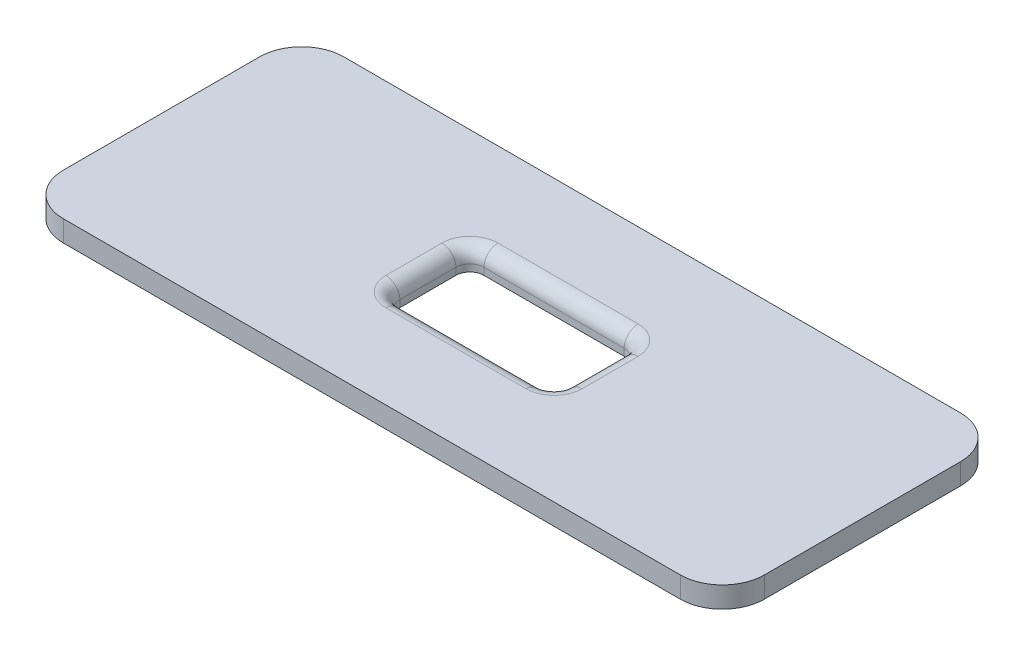
ISO-10303-21;
HEADER;
FILE_DESCRIPTION(('STEP AP214'),'2;1');
FILE_NAME('part.step','',(''),(''),'','','');
FILE_SCHEMA(('AUTOMOTIVE_DESIGN { 1 0 10303 214 1 1 1 1 }'));
ENDSEC;
DATA;
#1=APPLICATION_CONTEXT('core data for automotive mechanical design processes');
#2=APPLICATION_PROTOCOL_DEFINITION('international standard','automotive_design',2000,#1);
#3=PRODUCT_CONTEXT('',#1,'mechanical');
#4=PRODUCT('Part','Part','',(#3));
#5=PRODUCT_RELATED_PRODUCT_CATEGORY('part','',(#4));
#6=PRODUCT_DEFINITION_FORMATION('','',#4);
#7=PRODUCT_DEFINITION_CONTEXT('part definition',#1,'design');
#8=PRODUCT_DEFINITION('design','',#6,#7);
#9=PRODUCT_DEFINITION_SHAPE('','',#8);
#10=(LENGTH_UNIT() NAMED_UNIT(*) SI_UNIT(.MILLI.,.METRE.));
#11=(NAMED_UNIT(*) PLANE_ANGLE_UNIT() SI_UNIT($,.RADIAN.));
#12=(NAMED_UNIT(*) SI_UNIT($,.STERADIAN.) SOLID_ANGLE_UNIT());
#13=UNCERTAINTY_MEASURE_WITH_UNIT(LENGTH_MEASURE(1.E-05),#10,'distance_accuracy_value','');
#14=(GEOMETRIC_REPRESENTATION_CONTEXT(3) GLOBAL_UNCERTAINTY_ASSIGNED_CONTEXT((#13)) GLOBAL_UNIT_ASSIGNED_CONTEXT((#10,
#11,#12)) REPRESENTATION_CONTEXT('',''));
#15=CARTESIAN_POINT('',(0.,0.,0.));
#16=DIRECTION('',(0.,0.,1.));
#17=DIRECTION('',(1.,0.,0.));
#18=AXIS2_PLACEMENT_3D('',#15,#16,#17);
#19=CARTESIAN_POINT('',(22.,1.5,-7.));
#20=DIRECTION('',(0.,1.,0.));
#21=DIRECTION('',(0.,0.,1.));
#22=AXIS2_PLACEMENT_3D('',#19,#20,#21);
#23=PLANE('',#22);
#24=DIRECTION('',(1.,0.,0.));
#25=VECTOR('',#24,1.);
#26=CARTESIAN_POINT('',(22.,1.5,4.));
#27=LINE('',#26,#25);
#28=CARTESIAN_POINT('',(4.99999999999998,1.5,4.));
#29=VERTEX_POINT('',#28);
#30=CARTESIAN_POINT('',(-4.99999999999999,1.5,4.));
#31=VERTEX_POINT('',#30);
#32=EDGE_CURVE('E287',#29,#31,#27,.F.);
#33=ORIENTED_EDGE('',*,*,#32,.T.);
#34=CARTESIAN_POINT('',(-5.,1.5,2.));
#35=DIRECTION('',(0.,1.,0.));
#36=DIRECTION('',(0.,0.,1.));
#37=AXIS2_PLACEMENT_3D('',#34,#35,#36);
#38=CIRCLE('',#37,2.);
#39=CARTESIAN_POINT('',(-7.,1.5,1.99999999999999));
#40=VERTEX_POINT('',#39);
#41=EDGE_CURVE('E301',#31,#40,#38,.F.);
#42=ORIENTED_EDGE('',*,*,#41,.T.);
#43=DIRECTION('',(0.,0.,1.));
#44=VECTOR('',#43,1.);
#45=CARTESIAN_POINT('',(-7.,1.5,-6.99999999999999));
#46=LINE('',#45,#44);
#47=CARTESIAN_POINT('',(-7.,1.5,-1.99999999999999));
#48=VERTEX_POINT('',#47);
#49=EDGE_CURVE('E299',#40,#48,#46,.F.);
#50=ORIENTED_EDGE('',*,*,#49,.T.);
#51=CARTESIAN_POINT('',(-5.,1.5,-2.));
#52=DIRECTION('',(0.,1.,0.));
#53=DIRECTION('',(0.,0.,1.));
#54=AXIS2_PLACEMENT_3D('',#51,#52,#53);
#55=CIRCLE('',#54,2.);
#56=CARTESIAN_POINT('',(-4.99999999999999,1.5,-4.));
#57=VERTEX_POINT('',#56);
#58=EDGE_CURVE('E297',#48,#57,#55,.F.);
#59=ORIENTED_EDGE('',*,*,#58,.T.);
#60=DIRECTION('',(-1.,0.,0.));
#61=VECTOR('',#60,1.);
#62=CARTESIAN_POINT('',(22.,1.5,-4.));
#63=LINE('',#62,#61);
#64=CARTESIAN_POINT('',(4.99999999999999,1.5,-4.));
#65=VERTEX_POINT('',#64);
#66=EDGE_CURVE('E295',#57,#65,#63,.F.);
#67=ORIENTED_EDGE('',*,*,#66,.T.);
#68=CARTESIAN_POINT('',(5.,1.5,-2.));
#69=DIRECTION('',(0.,1.,0.));
#70=DIRECTION('',(0.,0.,1.));
#71=AXIS2_PLACEMENT_3D('',#68,#69,#70);
#72=CIRCLE('',#71,2.);
#73=CARTESIAN_POINT('',(7.,1.5,-1.99999999999998));
#74=VERTEX_POINT('',#73);
#75=EDGE_CURVE('E293',#65,#74,#72,.F.);
#76=ORIENTED_EDGE('',*,*,#75,.T.);
#77=DIRECTION('',(0.,0.,-1.));
#78=VECTOR('',#77,1.);
#79=CARTESIAN_POINT('',(7.,1.5,-6.99999999999999));
#80=LINE('',#79,#78);
#81=CARTESIAN_POINT('',(7.,1.5,2.));
#82=VERTEX_POINT('',#81);
#83=EDGE_CURVE('E291',#74,#82,#80,.F.);
#84=ORIENTED_EDGE('',*,*,#83,.T.);
#85=CARTESIAN_POINT('',(5.,1.5,2.));
#86=DIRECTION('',(0.,1.,0.));
#87=DIRECTION('',(0.,0.,1.));
#88=AXIS2_PLACEMENT_3D('',#85,#86,#87);
#89=CIRCLE('',#88,2.);
#90=EDGE_CURVE('E289',#82,#29,#89,.F.);
#91=ORIENTED_EDGE('',*,*,#90,.T.);
#92=EDGE_LOOP('',(#33,#42,#50,#59,#67,#76,#84,#91));
#93=FACE_BOUND('',#92,.T.);
#94=CARTESIAN_POINT('',(22.,1.5,-7.));
#95=DIRECTION('',(0.,1.,0.));
#96=DIRECTION('',(0.,0.,1.));
#97=AXIS2_PLACEMENT_3D('',#94,#95,#96);
#98=CIRCLE('',#97,3.);
#99=CARTESIAN_POINT('',(25.,1.5,-6.99999999999998));
#100=VERTEX_POINT('',#99);
#101=CARTESIAN_POINT('',(22.,1.5,-10.));
#102=VERTEX_POINT('',#101);
#103=EDGE_CURVE('E227',#100,#102,#98,.T.);
#104=ORIENTED_EDGE('',*,*,#103,.T.);
#105=DIRECTION('',(-1.,0.,0.));
#106=VECTOR('',#105,1.);
#107=CARTESIAN_POINT('',(-22.,1.5,-10.));
#108=LINE('',#107,#106);
#109=CARTESIAN_POINT('',(-22.,1.5,-10.));
#110=VERTEX_POINT('',#109);
#111=EDGE_CURVE('E230',#102,#110,#108,.T.);
#112=ORIENTED_EDGE('',*,*,#111,.T.);
#113=CARTESIAN_POINT('',(-22.,1.5,-7.));
#114=DIRECTION('',(0.,1.,0.));
#115=DIRECTION('',(0.,0.,-1.));
#116=AXIS2_PLACEMENT_3D('',#113,#114,#115);
#117=CIRCLE('',#116,3.);
#118=CARTESIAN_POINT('',(-25.,1.5,-6.99999999999998));
#119=VERTEX_POINT('',#118);
#120=EDGE_CURVE('E233',#110,#119,#117,.T.);
#121=ORIENTED_EDGE('',*,*,#120,.T.);
#122=DIRECTION('',(0.,0.,1.));
#123=VECTOR('',#122,1.);
#124=CARTESIAN_POINT('',(-25.,1.5,-6.99999999999998));
#125=LINE('',#124,#123);
#126=CARTESIAN_POINT('',(-25.,1.5,6.99999999999998));
#127=VERTEX_POINT('',#126);
#128=EDGE_CURVE('E235',#119,#127,#125,.T.);
#129=ORIENTED_EDGE('',*,*,#128,.T.);
#130=CARTESIAN_POINT('',(-22.,1.5,7.));
#131=DIRECTION('',(0.,1.,0.));
#132=DIRECTION('',(0.,0.,-1.));
#133=AXIS2_PLACEMENT_3D('',#130,#131,#132);
#134=CIRCLE('',#133,3.);
#135=CARTESIAN_POINT('',(-22.,1.5,10.));
#136=VERTEX_POINT('',#135);
#137=EDGE_CURVE('E237',#127,#136,#134,.T.);
#138=ORIENTED_EDGE('',*,*,#137,.T.);
#139=DIRECTION('',(1.,0.,0.));
#140=VECTOR('',#139,1.);
#141=CARTESIAN_POINT('',(-22.,1.5,10.));
#142=LINE('',#141,#140);
#143=CARTESIAN_POINT('',(22.,1.5,10.));
#144=VERTEX_POINT('',#143);
#145=EDGE_CURVE('E239',#136,#144,#142,.T.);
#146=ORIENTED_EDGE('',*,*,#145,.T.);
#147=CARTESIAN_POINT('',(22.,1.5,7.));
#148=DIRECTION('',(0.,1.,0.));
#149=DIRECTION('',(0.,0.,1.));
#150=AXIS2_PLACEMENT_3D('',#147,#148,#149);
#151=CIRCLE('',#150,3.);
#152=CARTESIAN_POINT('',(25.,1.5,6.99999999999998));
#153=VERTEX_POINT('',#152);
#154=EDGE_CURVE('E241',#144,#153,#151,.T.);
#155=ORIENTED_EDGE('',*,*,#154,.T.);
#156=DIRECTION('',(0.,0.,-1.));
#157=VECTOR('',#156,1.);
#158=CARTESIAN_POINT('',(25.,1.5,-6.99999999999998));
#159=LINE('',#158,#157);
#160=EDGE_CURVE('E243',#153,#100,#159,.T.);
#161=ORIENTED_EDGE('',*,*,#160,.T.);
#162=EDGE_LOOP('',(#104,#112,#121,#129,#138,#146,#155,#161));
#163=FACE_BOUND('',#162,.T.);
#164=ADVANCED_FACE('F33',(#93,#163),#23,.T.);
#165=CARTESIAN_POINT('',(22.,0.,-7.));
#166=DIRECTION('',(0.,1.,0.));
#167=DIRECTION('',(0.,0.,1.));
#168=AXIS2_PLACEMENT_3D('',#165,#166,#167);
#169=PLANE('',#168);
#170=CARTESIAN_POINT('',(22.,0.,-7.));
#171=DIRECTION('',(0.,1.,0.));
#172=DIRECTION('',(0.,0.,1.));
#173=AXIS2_PLACEMENT_3D('',#170,#171,#172);
#174=CIRCLE('',#173,3.);
#175=CARTESIAN_POINT('',(25.,0.,-6.99999999999998));
#176=VERTEX_POINT('',#175);
#177=CARTESIAN_POINT('',(22.,0.,-10.));
#178=VERTEX_POINT('',#177);
#179=EDGE_CURVE('E181',#176,#178,#174,.T.);
#180=ORIENTED_EDGE('',*,*,#179,.F.);
#181=DIRECTION('',(0.,0.,-1.));
#182=VECTOR('',#181,1.);
#183=CARTESIAN_POINT('',(25.,0.,-6.99999999999998));
#184=LINE('',#183,#182);
#185=CARTESIAN_POINT('',(25.,0.,6.99999999999998));
#186=VERTEX_POINT('',#185);
#187=EDGE_CURVE('E231',#186,#176,#184,.T.);
#188=ORIENTED_EDGE('',*,*,#187,.F.);
#189=CARTESIAN_POINT('',(22.,0.,7.));
#190=DIRECTION('',(0.,1.,0.));
#191=DIRECTION('',(0.,0.,1.));
#192=AXIS2_PLACEMENT_3D('',#189,#190,#191);
#193=CIRCLE('',#192,3.);
#194=CARTESIAN_POINT('',(22.,0.,10.));
#195=VERTEX_POINT('',#194);
#196=EDGE_CURVE('E258',#195,#186,#193,.T.);
#197=ORIENTED_EDGE('',*,*,#196,.F.);
#198=DIRECTION('',(1.,0.,0.));
#199=VECTOR('',#198,1.);
#200=CARTESIAN_POINT('',(-22.,0.,10.));
#201=LINE('',#200,#199);
#202=CARTESIAN_POINT('',(-22.,0.,10.));
#203=VERTEX_POINT('',#202);
#204=EDGE_CURVE('E256',#203,#195,#201,.T.);
#205=ORIENTED_EDGE('',*,*,#204,.F.);
#206=CARTESIAN_POINT('',(-22.,0.,7.));
#207=DIRECTION('',(0.,1.,0.));
#208=DIRECTION('',(0.,0.,-1.));
#209=AXIS2_PLACEMENT_3D('',#206,#207,#208);
#210=CIRCLE('',#209,3.);
#211=CARTESIAN_POINT('',(-25.,0.,6.99999999999998));
#212=VERTEX_POINT('',#211);
#213=EDGE_CURVE('E254',#212,#203,#210,.T.);
#214=ORIENTED_EDGE('',*,*,#213,.F.);
#215=DIRECTION('',(0.,0.,1.));
#216=VECTOR('',#215,1.);
#217=CARTESIAN_POINT('',(-25.,0.,-6.99999999999998));
#218=LINE('',#217,#216);
#219=CARTESIAN_POINT('',(-25.,0.,-6.99999999999998));
#220=VERTEX_POINT('',#219);
#221=EDGE_CURVE('E252',#220,#212,#218,.T.);
#222=ORIENTED_EDGE('',*,*,#221,.F.);
#223=CARTESIAN_POINT('',(-22.,0.,-7.));
#224=DIRECTION('',(0.,1.,0.));
#225=DIRECTION('',(0.,0.,-1.));
#226=AXIS2_PLACEMENT_3D('',#223,#224,#225);
#227=CIRCLE('',#226,3.);
#228=CARTESIAN_POINT('',(-22.,0.,-10.));
#229=VERTEX_POINT('',#228);
#230=EDGE_CURVE('E250',#229,#220,#227,.T.);
#231=ORIENTED_EDGE('',*,*,#230,.F.);
#232=DIRECTION('',(-1.,0.,0.));
#233=VECTOR('',#232,1.);
#234=CARTESIAN_POINT('',(-22.,0.,-10.));
#235=LINE('',#234,#233);
#236=EDGE_CURVE('E248',#178,#229,#235,.T.);
#237=ORIENTED_EDGE('',*,*,#236,.F.);
#238=EDGE_LOOP('',(#180,#188,#197,#205,#214,#222,#231,#237));
#239=FACE_BOUND('',#238,.T.);
#240=CARTESIAN_POINT('',(5.,0.,-2.));
#241=DIRECTION('',(0.,1.,0.));
#242=DIRECTION('',(0.,0.,-1.));
#243=AXIS2_PLACEMENT_3D('',#240,#241,#242);
#244=CIRCLE('',#243,1.);
#245=CARTESIAN_POINT('',(6.,0.,-1.99999999999999));
#246=VERTEX_POINT('',#245);
#247=CARTESIAN_POINT('',(4.99999999999999,0.,-3.));
#248=VERTEX_POINT('',#247);
#249=EDGE_CURVE('E175',#246,#248,#244,.T.);
#250=ORIENTED_EDGE('',*,*,#249,.T.);
#251=DIRECTION('',(-1.,0.,0.));
#252=VECTOR('',#251,1.);
#253=CARTESIAN_POINT('',(-5.,0.,-3.));
#254=LINE('',#253,#252);
#255=CARTESIAN_POINT('',(-5.,0.,-3.));
#256=VERTEX_POINT('',#255);
#257=EDGE_CURVE('E185',#248,#256,#254,.T.);
#258=ORIENTED_EDGE('',*,*,#257,.T.);
#259=CARTESIAN_POINT('',(-5.,0.,-2.));
#260=DIRECTION('',(0.,1.,0.));
#261=DIRECTION('',(0.,0.,-1.));
#262=AXIS2_PLACEMENT_3D('',#259,#260,#261);
#263=CIRCLE('',#262,1.);
#264=CARTESIAN_POINT('',(-6.,0.,-1.99999999999999));
#265=VERTEX_POINT('',#264);
#266=EDGE_CURVE('E191',#256,#265,#263,.T.);
#267=ORIENTED_EDGE('',*,*,#266,.T.);
#268=DIRECTION('',(0.,0.,1.));
#269=VECTOR('',#268,1.);
#270=CARTESIAN_POINT('',(-6.,0.,-1.99999999999999));
#271=LINE('',#270,#269);
#272=CARTESIAN_POINT('',(-6.,0.,2.));
#273=VERTEX_POINT('',#272);
#274=EDGE_CURVE('E202',#265,#273,#271,.T.);
#275=ORIENTED_EDGE('',*,*,#274,.T.);
#276=CARTESIAN_POINT('',(-5.,0.,2.));
#277=DIRECTION('',(0.,1.,0.));
#278=DIRECTION('',(0.,0.,-1.));
#279=AXIS2_PLACEMENT_3D('',#276,#277,#278);
#280=CIRCLE('',#279,1.);
#281=CARTESIAN_POINT('',(-5.,0.,3.));
#282=VERTEX_POINT('',#281);
#283=EDGE_CURVE('E205',#273,#282,#280,.T.);
#284=ORIENTED_EDGE('',*,*,#283,.T.);
#285=DIRECTION('',(1.,0.,0.));
#286=VECTOR('',#285,1.);
#287=CARTESIAN_POINT('',(-5.,0.,3.));
#288=LINE('',#287,#286);
#289=CARTESIAN_POINT('',(4.99999999999999,0.,3.));
#290=VERTEX_POINT('',#289);
#291=EDGE_CURVE('E208',#282,#290,#288,.T.);
#292=ORIENTED_EDGE('',*,*,#291,.T.);
#293=CARTESIAN_POINT('',(5.,0.,2.));
#294=DIRECTION('',(0.,1.,0.));
#295=DIRECTION('',(0.,0.,-1.));
#296=AXIS2_PLACEMENT_3D('',#293,#294,#295);
#297=CIRCLE('',#296,1.);
#298=CARTESIAN_POINT('',(6.,0.,2.));
#299=VERTEX_POINT('',#298);
#300=EDGE_CURVE('E211',#290,#299,#297,.T.);
#301=ORIENTED_EDGE('',*,*,#300,.T.);
#302=DIRECTION('',(0.,0.,-1.));
#303=VECTOR('',#302,1.);
#304=CARTESIAN_POINT('',(6.,0.,-1.99999999999999));
#305=LINE('',#304,#303);
#306=EDGE_CURVE('E196',#299,#246,#305,.T.);
#307=ORIENTED_EDGE('',*,*,#306,.T.);
#308=EDGE_LOOP('',(#250,#258,#267,#275,#284,#292,#301,#307));
#309=FACE_BOUND('',#308,.T.);
#310=ADVANCED_FACE('F193',(#239,#309),#169,.F.);
#311=CARTESIAN_POINT('',(22.,1.5,-7.));
#312=DIRECTION('',(0.,-1.,0.));
#313=DIRECTION('',(0.,0.,-1.));
#314=AXIS2_PLACEMENT_3D('',#311,#312,#313);
#315=CYLINDRICAL_SURFACE('',#314,3.);
#316=ORIENTED_EDGE('',*,*,#179,.T.);
#317=DIRECTION('',(0.,-1.,0.));
#318=VECTOR('',#317,1.);
#319=CARTESIAN_POINT('',(22.,1.5,-10.));
#320=LINE('',#319,#318);
#321=EDGE_CURVE('E281',#102,#178,#320,.T.);
#322=ORIENTED_EDGE('',*,*,#321,.F.);
#323=ORIENTED_EDGE('',*,*,#103,.F.);
#324=DIRECTION('',(0.,-1.,0.));
#325=VECTOR('',#324,1.);
#326=CARTESIAN_POINT('',(25.,1.5,-6.99999999999998));
#327=LINE('',#326,#325);
#328=EDGE_CURVE('E245',#100,#176,#327,.T.);
#329=ORIENTED_EDGE('',*,*,#328,.T.);
#330=EDGE_LOOP('',(#316,#322,#323,#329));
#331=FACE_BOUND('',#330,.T.);
#332=ADVANCED_FACE('F377',(#331),#315,.T.);
#333=CARTESIAN_POINT('',(-22.,1.5,-10.));
#334=DIRECTION('',(0.,0.,1.));
#335=DIRECTION('',(1.,0.,0.));
#336=AXIS2_PLACEMENT_3D('',#333,#334,#335);
#337=PLANE('',#336);
#338=ORIENTED_EDGE('',*,*,#236,.T.);
#339=DIRECTION('',(0.,-1.,0.));
#340=VECTOR('',#339,1.);
#341=CARTESIAN_POINT('',(-22.,1.5,-10.));
#342=LINE('',#341,#340);
#343=EDGE_CURVE('E278',#110,#229,#342,.T.);
#344=ORIENTED_EDGE('',*,*,#343,.F.);
#345=ORIENTED_EDGE('',*,*,#111,.F.);
#346=ORIENTED_EDGE('',*,*,#321,.T.);
#347=EDGE_LOOP('',(#338,#344,#345,#346));
#348=FACE_BOUND('',#347,.T.);
#349=ADVANCED_FACE('F407',(#348),#337,.F.);
#350=CARTESIAN_POINT('',(-22.,1.5,-7.));
#351=DIRECTION('',(0.,-1.,0.));
#352=DIRECTION('',(0.,0.,-1.));
#353=AXIS2_PLACEMENT_3D('',#350,#351,#352);
#354=CYLINDRICAL_SURFACE('',#353,3.);
#355=ORIENTED_EDGE('',*,*,#230,.T.);
#356=DIRECTION('',(0.,-1.,0.));
#357=VECTOR('',#356,1.);
#358=CARTESIAN_POINT('',(-25.,1.5,-6.99999999999998));
#359=LINE('',#358,#357);
#360=EDGE_CURVE('E275',#119,#220,#359,.T.);
#361=ORIENTED_EDGE('',*,*,#360,.F.);
#362=ORIENTED_EDGE('',*,*,#120,.F.);
#363=ORIENTED_EDGE('',*,*,#343,.T.);
#364=EDGE_LOOP('',(#355,#361,#362,#363));
#365=FACE_BOUND('',#364,.T.);
#366=ADVANCED_FACE('F403',(#365),#354,.T.);
#367=CARTESIAN_POINT('',(-25.,1.5,-6.99999999999998));
#368=DIRECTION('',(1.,0.,0.));
#369=DIRECTION('',(0.,0.,-1.));
#370=AXIS2_PLACEMENT_3D('',#367,#368,#369);
#371=PLANE('',#370);
#372=ORIENTED_EDGE('',*,*,#221,.T.);
#373=DIRECTION('',(0.,-1.,0.));
#374=VECTOR('',#373,1.);
#375=CARTESIAN_POINT('',(-25.,1.5,6.99999999999998));
#376=LINE('',#375,#374);
#377=EDGE_CURVE('E272',#127,#212,#376,.T.);
#378=ORIENTED_EDGE('',*,*,#377,.F.);
#379=ORIENTED_EDGE('',*,*,#128,.F.);
#380=ORIENTED_EDGE('',*,*,#360,.T.);
#381=EDGE_LOOP('',(#372,#378,#379,#380));
#382=FACE_BOUND('',#381,.T.);
#383=ADVANCED_FACE('F399',(#382),#371,.F.);
#384=CARTESIAN_POINT('',(-22.,1.5,7.));
#385=DIRECTION('',(0.,-1.,0.));
#386=DIRECTION('',(0.,0.,-1.));
#387=AXIS2_PLACEMENT_3D('',#384,#385,#386);
#388=CYLINDRICAL_SURFACE('',#387,3.);
#389=ORIENTED_EDGE('',*,*,#213,.T.);
#390=DIRECTION('',(0.,-1.,0.));
#391=VECTOR('',#390,1.);
#392=CARTESIAN_POINT('',(-22.,1.5,10.));
#393=LINE('',#392,#391);
#394=EDGE_CURVE('E269',#136,#203,#393,.T.);
#395=ORIENTED_EDGE('',*,*,#394,.F.);
#396=ORIENTED_EDGE('',*,*,#137,.F.);
#397=ORIENTED_EDGE('',*,*,#377,.T.);
#398=EDGE_LOOP('',(#389,#395,#396,#397));
#399=FACE_BOUND('',#398,.T.);
#400=ADVANCED_FACE('F395',(#399),#388,.T.);
#401=CARTESIAN_POINT('',(-22.,1.5,10.));
#402=DIRECTION('',(0.,0.,-1.));
#403=DIRECTION('',(-1.,0.,0.));
#404=AXIS2_PLACEMENT_3D('',#401,#402,#403);
#405=PLANE('',#404);
#406=ORIENTED_EDGE('',*,*,#204,.T.);
#407=DIRECTION('',(0.,-1.,0.));
#408=VECTOR('',#407,1.);
#409=CARTESIAN_POINT('',(22.,1.5,10.));
#410=LINE('',#409,#408);
#411=EDGE_CURVE('E266',#144,#195,#410,.T.);
#412=ORIENTED_EDGE('',*,*,#411,.F.);
#413=ORIENTED_EDGE('',*,*,#145,.F.);
#414=ORIENTED_EDGE('',*,*,#394,.T.);
#415=EDGE_LOOP('',(#406,#412,#413,#414));
#416=FACE_BOUND('',#415,.T.);
#417=ADVANCED_FACE('F391',(#416),#405,.F.);
#418=CARTESIAN_POINT('',(22.,1.5,7.));
#419=DIRECTION('',(0.,-1.,0.));
#420=DIRECTION('',(0.,0.,-1.));
#421=AXIS2_PLACEMENT_3D('',#418,#419,#420);
#422=CYLINDRICAL_SURFACE('',#421,3.);
#423=ORIENTED_EDGE('',*,*,#196,.T.);
#424=DIRECTION('',(0.,-1.,0.));
#425=VECTOR('',#424,1.);
#426=CARTESIAN_POINT('',(25.,1.5,6.99999999999998));
#427=LINE('',#426,#425);
#428=EDGE_CURVE('E263',#153,#186,#427,.T.);
#429=ORIENTED_EDGE('',*,*,#428,.F.);
#430=ORIENTED_EDGE('',*,*,#154,.F.);
#431=ORIENTED_EDGE('',*,*,#411,.T.);
#432=EDGE_LOOP('',(#423,#429,#430,#431));
#433=FACE_BOUND('',#432,.T.);
#434=ADVANCED_FACE('F387',(#433),#422,.T.);
#435=CARTESIAN_POINT('',(25.,1.5,-6.99999999999998));
#436=DIRECTION('',(-1.,0.,0.));
#437=DIRECTION('',(0.,0.,1.));
#438=AXIS2_PLACEMENT_3D('',#435,#436,#437);
#439=PLANE('',#438);
#440=ORIENTED_EDGE('',*,*,#187,.T.);
#441=ORIENTED_EDGE('',*,*,#328,.F.);
#442=ORIENTED_EDGE('',*,*,#160,.F.);
#443=ORIENTED_EDGE('',*,*,#428,.T.);
#444=EDGE_LOOP('',(#440,#441,#442,#443));
#445=FACE_BOUND('',#444,.T.);
#446=ADVANCED_FACE('F384',(#445),#439,.F.);
#447=CARTESIAN_POINT('',(5.,1.5,-2.));
#448=DIRECTION('',(0.,-1.,0.));
#449=DIRECTION('',(0.,0.,-1.));
#450=AXIS2_PLACEMENT_3D('',#447,#448,#449);
#451=CYLINDRICAL_SURFACE('',#450,1.);
#452=DIRECTION('',(0.,-1.,0.));
#453=VECTOR('',#452,1.);
#454=CARTESIAN_POINT('',(6.,1.5,-1.99999999999999));
#455=LINE('',#454,#453);
#456=CARTESIAN_POINT('',(6.,0.5,-1.99999999999999));
#457=VERTEX_POINT('',#456);
#458=EDGE_CURVE('E214',#457,#246,#455,.T.);
#459=ORIENTED_EDGE('',*,*,#458,.F.);
#460=CARTESIAN_POINT('',(5.,0.5,-2.));
#461=DIRECTION('',(0.,1.,0.));
#462=DIRECTION('',(0.,0.,1.));
#463=AXIS2_PLACEMENT_3D('',#460,#461,#462);
#464=CIRCLE('',#463,1.);
#465=CARTESIAN_POINT('',(4.99999999999999,0.5,-3.));
#466=VERTEX_POINT('',#465);
#467=EDGE_CURVE('E178',#457,#466,#464,.T.);
#468=ORIENTED_EDGE('',*,*,#467,.T.);
#469=DIRECTION('',(0.,-1.,0.));
#470=VECTOR('',#469,1.);
#471=CARTESIAN_POINT('',(4.99999999999999,1.5,-3.));
#472=LINE('',#471,#470);
#473=EDGE_CURVE('E170',#466,#248,#472,.T.);
#474=ORIENTED_EDGE('',*,*,#473,.T.);
#475=ORIENTED_EDGE('',*,*,#249,.F.);
#476=EDGE_LOOP('',(#459,#468,#474,#475));
#477=FACE_BOUND('',#476,.T.);
#478=ADVANCED_FACE('F173',(#477),#451,.F.);
#479=CARTESIAN_POINT('',(-5.,1.5,-3.));
#480=DIRECTION('',(0.,0.,1.));
#481=DIRECTION('',(1.,0.,0.));
#482=AXIS2_PLACEMENT_3D('',#479,#480,#481);
#483=PLANE('',#482);
#484=ORIENTED_EDGE('',*,*,#473,.F.);
#485=DIRECTION('',(-1.,0.,0.));
#486=VECTOR('',#485,1.);
#487=CARTESIAN_POINT('',(-5.,0.5,-3.));
#488=LINE('',#487,#486);
#489=CARTESIAN_POINT('',(-5.,0.5,-3.));
#490=VERTEX_POINT('',#489);
#491=EDGE_CURVE('E308',#466,#490,#488,.T.);
#492=ORIENTED_EDGE('',*,*,#491,.T.);
#493=DIRECTION('',(0.,-1.,0.));
#494=VECTOR('',#493,1.);
#495=CARTESIAN_POINT('',(-5.,1.5,-3.));
#496=LINE('',#495,#494);
#497=EDGE_CURVE('E182',#490,#256,#496,.T.);
#498=ORIENTED_EDGE('',*,*,#497,.T.);
#499=ORIENTED_EDGE('',*,*,#257,.F.);
#500=EDGE_LOOP('',(#484,#492,#498,#499));
#501=FACE_BOUND('',#500,.T.);
#502=ADVANCED_FACE('F186',(#501),#483,.T.);
#503=CARTESIAN_POINT('',(-5.,1.5,-2.));
#504=DIRECTION('',(0.,-1.,0.));
#505=DIRECTION('',(0.,0.,-1.));
#506=AXIS2_PLACEMENT_3D('',#503,#504,#505);
#507=CYLINDRICAL_SURFACE('',#506,1.);
#508=ORIENTED_EDGE('',*,*,#497,.F.);
#509=CARTESIAN_POINT('',(-5.,0.5,-2.));
#510=DIRECTION('',(0.,1.,0.));
#511=DIRECTION('',(0.,0.,1.));
#512=AXIS2_PLACEMENT_3D('',#509,#510,#511);
#513=CIRCLE('',#512,1.);
#514=CARTESIAN_POINT('',(-6.,0.5,-1.99999999999999));
#515=VERTEX_POINT('',#514);
#516=EDGE_CURVE('E306',#490,#515,#513,.T.);
#517=ORIENTED_EDGE('',*,*,#516,.T.);
#518=DIRECTION('',(0.,-1.,0.));
#519=VECTOR('',#518,1.);
#520=CARTESIAN_POINT('',(-6.,1.5,-1.99999999999999));
#521=LINE('',#520,#519);
#522=EDGE_CURVE('E224',#515,#265,#521,.T.);
#523=ORIENTED_EDGE('',*,*,#522,.T.);
#524=ORIENTED_EDGE('',*,*,#266,.F.);
#525=EDGE_LOOP('',(#508,#517,#523,#524));
#526=FACE_BOUND('',#525,.T.);
#527=ADVANCED_FACE('F345',(#526),#507,.F.);
#528=CARTESIAN_POINT('',(-6.,1.5,-1.99999999999999));
#529=DIRECTION('',(1.,0.,0.));
#530=DIRECTION('',(0.,0.,-1.));
#531=AXIS2_PLACEMENT_3D('',#528,#529,#530);
#532=PLANE('',#531);
#533=ORIENTED_EDGE('',*,*,#522,.F.);
#534=DIRECTION('',(0.,0.,1.));
#535=VECTOR('',#534,1.);
#536=CARTESIAN_POINT('',(-6.,0.5,-1.99999999999999));
#537=LINE('',#536,#535);
#538=CARTESIAN_POINT('',(-6.,0.5,2.));
#539=VERTEX_POINT('',#538);
#540=EDGE_CURVE('E304',#515,#539,#537,.T.);
#541=ORIENTED_EDGE('',*,*,#540,.T.);
#542=DIRECTION('',(0.,-1.,0.));
#543=VECTOR('',#542,1.);
#544=CARTESIAN_POINT('',(-6.,1.5,2.));
#545=LINE('',#544,#543);
#546=EDGE_CURVE('E222',#539,#273,#545,.T.);
#547=ORIENTED_EDGE('',*,*,#546,.T.);
#548=ORIENTED_EDGE('',*,*,#274,.F.);
#549=EDGE_LOOP('',(#533,#541,#547,#548));
#550=FACE_BOUND('',#549,.T.);
#551=ADVANCED_FACE('F350',(#550),#532,.T.);
#552=CARTESIAN_POINT('',(-5.,1.5,2.));
#553=DIRECTION('',(0.,-1.,0.));
#554=DIRECTION('',(0.,0.,-1.));
#555=AXIS2_PLACEMENT_3D('',#552,#553,#554);
#556=CYLINDRICAL_SURFACE('',#555,1.);
#557=ORIENTED_EDGE('',*,*,#546,.F.);
#558=CARTESIAN_POINT('',(-5.,0.5,2.));
#559=DIRECTION('',(0.,1.,0.));
#560=DIRECTION('',(0.,0.,1.));
#561=AXIS2_PLACEMENT_3D('',#558,#559,#560);
#562=CIRCLE('',#561,1.);
#563=CARTESIAN_POINT('',(-5.,0.5,3.));
#564=VERTEX_POINT('',#563);
#565=EDGE_CURVE('E284',#539,#564,#562,.T.);
#566=ORIENTED_EDGE('',*,*,#565,.T.);
#567=DIRECTION('',(0.,-1.,0.));
#568=VECTOR('',#567,1.);
#569=CARTESIAN_POINT('',(-5.,1.5,3.));
#570=LINE('',#569,#568);
#571=EDGE_CURVE('E220',#564,#282,#570,.T.);
#572=ORIENTED_EDGE('',*,*,#571,.T.);
#573=ORIENTED_EDGE('',*,*,#283,.F.);
#574=EDGE_LOOP('',(#557,#566,#572,#573));
#575=FACE_BOUND('',#574,.T.);
#576=ADVANCED_FACE('F356',(#575),#556,.F.);
#577=CARTESIAN_POINT('',(-5.,1.5,3.));
#578=DIRECTION('',(0.,0.,-1.));
#579=DIRECTION('',(-1.,0.,0.));
#580=AXIS2_PLACEMENT_3D('',#577,#578,#579);
#581=PLANE('',#580);
#582=ORIENTED_EDGE('',*,*,#571,.F.);
#583=DIRECTION('',(1.,0.,0.));
#584=VECTOR('',#583,1.);
#585=CARTESIAN_POINT('',(-5.,0.5,3.));
#586=LINE('',#585,#584);
#587=CARTESIAN_POINT('',(4.99999999999999,0.5,3.));
#588=VERTEX_POINT('',#587);
#589=EDGE_CURVE('E11',#564,#588,#586,.T.);
#590=ORIENTED_EDGE('',*,*,#589,.T.);
#591=DIRECTION('',(0.,-1.,0.));
#592=VECTOR('',#591,1.);
#593=CARTESIAN_POINT('',(4.99999999999999,1.5,3.));
#594=LINE('',#593,#592);
#595=EDGE_CURVE('E218',#588,#290,#594,.T.);
#596=ORIENTED_EDGE('',*,*,#595,.T.);
#597=ORIENTED_EDGE('',*,*,#291,.F.);
#598=EDGE_LOOP('',(#582,#590,#596,#597));
#599=FACE_BOUND('',#598,.T.);
#600=ADVANCED_FACE('F359',(#599),#581,.T.);
#601=CARTESIAN_POINT('',(5.,1.5,2.));
#602=DIRECTION('',(0.,-1.,0.));
#603=DIRECTION('',(0.,0.,-1.));
#604=AXIS2_PLACEMENT_3D('',#601,#602,#603);
#605=CYLINDRICAL_SURFACE('',#604,1.);
#606=ORIENTED_EDGE('',*,*,#595,.F.);
#607=CARTESIAN_POINT('',(5.,0.5,2.));
#608=DIRECTION('',(0.,1.,0.));
#609=DIRECTION('',(0.,0.,1.));
#610=AXIS2_PLACEMENT_3D('',#607,#608,#609);
#611=CIRCLE('',#610,1.);
#612=CARTESIAN_POINT('',(6.,0.5,2.));
#613=VERTEX_POINT('',#612);
#614=EDGE_CURVE('E42',#588,#613,#611,.T.);
#615=ORIENTED_EDGE('',*,*,#614,.T.);
#616=DIRECTION('',(0.,-1.,0.));
#617=VECTOR('',#616,1.);
#618=CARTESIAN_POINT('',(6.,1.5,2.));
#619=LINE('',#618,#617);
#620=EDGE_CURVE('E216',#613,#299,#619,.T.);
#621=ORIENTED_EDGE('',*,*,#620,.T.);
#622=ORIENTED_EDGE('',*,*,#300,.F.);
#623=EDGE_LOOP('',(#606,#615,#621,#622));
#624=FACE_BOUND('',#623,.T.);
#625=ADVANCED_FACE('F361',(#624),#605,.F.);
#626=CARTESIAN_POINT('',(6.,1.5,-1.99999999999999));
#627=DIRECTION('',(-1.,0.,0.));
#628=DIRECTION('',(0.,0.,1.));
#629=AXIS2_PLACEMENT_3D('',#626,#627,#628);
#630=PLANE('',#629);
#631=ORIENTED_EDGE('',*,*,#620,.F.);
#632=DIRECTION('',(0.,0.,-1.));
#633=VECTOR('',#632,1.);
#634=CARTESIAN_POINT('',(6.,0.5,-1.99999999999999));
#635=LINE('',#634,#633);
#636=EDGE_CURVE('E311',#613,#457,#635,.T.);
#637=ORIENTED_EDGE('',*,*,#636,.T.);
#638=ORIENTED_EDGE('',*,*,#458,.T.);
#639=ORIENTED_EDGE('',*,*,#306,.F.);
#640=EDGE_LOOP('',(#631,#637,#638,#639));
#641=FACE_BOUND('',#640,.T.);
#642=ADVANCED_FACE('F363',(#641),#630,.T.);
#643=CARTESIAN_POINT('',(5.,0.5,-2.));
#644=DIRECTION('',(0.,1.,0.));
#645=DIRECTION('',(0.,0.,1.));
#646=AXIS2_PLACEMENT_3D('',#643,#644,#645);
#647=TOROIDAL_SURFACE('',#646,2.,1.);
#648=CARTESIAN_POINT('',(7.,0.5,-1.99999999999998));
#649=DIRECTION('',(0.,0.,1.));
#650=DIRECTION('',(1.,0.,0.));
#651=AXIS2_PLACEMENT_3D('',#648,#649,#650);
#652=CIRCLE('',#651,1.);
#653=EDGE_CURVE('E199',#74,#457,#652,.T.);
#654=ORIENTED_EDGE('',*,*,#653,.F.);
#655=ORIENTED_EDGE('',*,*,#75,.F.);
#656=CARTESIAN_POINT('',(4.99999999999998,0.5,-4.));
#657=DIRECTION('',(-1.,0.,0.));
#658=DIRECTION('',(0.,0.,1.));
#659=AXIS2_PLACEMENT_3D('',#656,#657,#658);
#660=CIRCLE('',#659,1.);
#661=EDGE_CURVE('E37',#466,#65,#660,.T.);
#662=ORIENTED_EDGE('',*,*,#661,.F.);
#663=ORIENTED_EDGE('',*,*,#467,.F.);
#664=EDGE_LOOP('',(#654,#655,#662,#663));
#665=FACE_BOUND('',#664,.T.);
#666=ADVANCED_FACE('F35',(#665),#647,.T.);
#667=CARTESIAN_POINT('',(-5.,0.5,-4.));
#668=DIRECTION('',(-1.,0.,0.));
#669=DIRECTION('',(0.,0.,1.));
#670=AXIS2_PLACEMENT_3D('',#667,#668,#669);
#671=CYLINDRICAL_SURFACE('',#670,1.);
#672=ORIENTED_EDGE('',*,*,#661,.T.);
#673=ORIENTED_EDGE('',*,*,#66,.F.);
#674=CARTESIAN_POINT('',(-5.,0.5,-4.));
#675=DIRECTION('',(-1.,0.,0.));
#676=DIRECTION('',(0.,-1.,0.));
#677=AXIS2_PLACEMENT_3D('',#674,#675,#676);
#678=CIRCLE('',#677,1.);
#679=EDGE_CURVE('E327',#490,#57,#678,.T.);
#680=ORIENTED_EDGE('',*,*,#679,.F.);
#681=ORIENTED_EDGE('',*,*,#491,.F.);
#682=EDGE_LOOP('',(#672,#673,#680,#681));
#683=FACE_BOUND('',#682,.T.);
#684=ADVANCED_FACE('F342',(#683),#671,.T.);
#685=CARTESIAN_POINT('',(7.,0.5,-1.99999999999999));
#686=DIRECTION('',(0.,0.,-1.));
#687=DIRECTION('',(-1.,0.,0.));
#688=AXIS2_PLACEMENT_3D('',#685,#686,#687);
#689=CYLINDRICAL_SURFACE('',#688,1.);
#690=ORIENTED_EDGE('',*,*,#653,.T.);
#691=ORIENTED_EDGE('',*,*,#636,.F.);
#692=CARTESIAN_POINT('',(7.,0.5,2.));
#693=DIRECTION('',(0.,0.,1.));
#694=DIRECTION('',(1.,0.,0.));
#695=AXIS2_PLACEMENT_3D('',#692,#693,#694);
#696=CIRCLE('',#695,1.);
#697=EDGE_CURVE('E324',#82,#613,#696,.T.);
#698=ORIENTED_EDGE('',*,*,#697,.F.);
#699=ORIENTED_EDGE('',*,*,#83,.F.);
#700=EDGE_LOOP('',(#690,#691,#698,#699));
#701=FACE_BOUND('',#700,.T.);
#702=ADVANCED_FACE('F334',(#701),#689,.T.);
#703=CARTESIAN_POINT('',(-5.,0.5,-2.));
#704=DIRECTION('',(0.,1.,0.));
#705=DIRECTION('',(0.,0.,1.));
#706=AXIS2_PLACEMENT_3D('',#703,#704,#705);
#707=TOROIDAL_SURFACE('',#706,2.,1.);
#708=ORIENTED_EDGE('',*,*,#679,.T.);
#709=ORIENTED_EDGE('',*,*,#58,.F.);
#710=CARTESIAN_POINT('',(-7.,0.5,-1.99999999999998));
#711=DIRECTION('',(0.,0.,1.));
#712=DIRECTION('',(1.,0.,0.));
#713=AXIS2_PLACEMENT_3D('',#710,#711,#712);
#714=CIRCLE('',#713,1.);
#715=EDGE_CURVE('E321',#515,#48,#714,.T.);
#716=ORIENTED_EDGE('',*,*,#715,.F.);
#717=ORIENTED_EDGE('',*,*,#516,.F.);
#718=EDGE_LOOP('',(#708,#709,#716,#717));
#719=FACE_BOUND('',#718,.T.);
#720=ADVANCED_FACE('F430',(#719),#707,.T.);
#721=CARTESIAN_POINT('',(5.,0.5,2.));
#722=DIRECTION('',(0.,1.,0.));
#723=DIRECTION('',(0.,0.,1.));
#724=AXIS2_PLACEMENT_3D('',#721,#722,#723);
#725=TOROIDAL_SURFACE('',#724,2.,1.);
#726=ORIENTED_EDGE('',*,*,#697,.T.);
#727=ORIENTED_EDGE('',*,*,#614,.F.);
#728=CARTESIAN_POINT('',(4.99999999999998,0.5,4.));
#729=DIRECTION('',(-1.,0.,0.));
#730=DIRECTION('',(0.,0.,1.));
#731=AXIS2_PLACEMENT_3D('',#728,#729,#730);
#732=CIRCLE('',#731,1.);
#733=EDGE_CURVE('E318',#29,#588,#732,.T.);
#734=ORIENTED_EDGE('',*,*,#733,.F.);
#735=ORIENTED_EDGE('',*,*,#90,.F.);
#736=EDGE_LOOP('',(#726,#727,#734,#735));
#737=FACE_BOUND('',#736,.T.);
#738=ADVANCED_FACE('F426',(#737),#725,.T.);
#739=CARTESIAN_POINT('',(-7.,0.5,-1.99999999999999));
#740=DIRECTION('',(0.,0.,1.));
#741=DIRECTION('',(1.,0.,0.));
#742=AXIS2_PLACEMENT_3D('',#739,#740,#741);
#743=CYLINDRICAL_SURFACE('',#742,1.);
#744=ORIENTED_EDGE('',*,*,#715,.T.);
#745=ORIENTED_EDGE('',*,*,#49,.F.);
#746=CARTESIAN_POINT('',(-7.,0.5,2.));
#747=DIRECTION('',(0.,0.,1.));
#748=DIRECTION('',(0.,-1.,0.));
#749=AXIS2_PLACEMENT_3D('',#746,#747,#748);
#750=CIRCLE('',#749,1.);
#751=EDGE_CURVE('E316',#539,#40,#750,.T.);
#752=ORIENTED_EDGE('',*,*,#751,.F.);
#753=ORIENTED_EDGE('',*,*,#540,.F.);
#754=EDGE_LOOP('',(#744,#745,#752,#753));
#755=FACE_BOUND('',#754,.T.);
#756=ADVANCED_FACE('F422',(#755),#743,.T.);
#757=CARTESIAN_POINT('',(-5.,0.5,4.));
#758=DIRECTION('',(1.,0.,0.));
#759=DIRECTION('',(0.,0.,-1.));
#760=AXIS2_PLACEMENT_3D('',#757,#758,#759);
#761=CYLINDRICAL_SURFACE('',#760,1.);
#762=ORIENTED_EDGE('',*,*,#733,.T.);
#763=ORIENTED_EDGE('',*,*,#589,.F.);
#764=CARTESIAN_POINT('',(-4.99999999999999,0.5,4.));
#765=DIRECTION('',(-1.,0.,0.));
#766=DIRECTION('',(0.,0.,1.));
#767=AXIS2_PLACEMENT_3D('',#764,#765,#766);
#768=CIRCLE('',#767,1.);
#769=EDGE_CURVE('E314',#31,#564,#768,.T.);
#770=ORIENTED_EDGE('',*,*,#769,.F.);
#771=ORIENTED_EDGE('',*,*,#32,.F.);
#772=EDGE_LOOP('',(#762,#763,#770,#771));
#773=FACE_BOUND('',#772,.T.);
#774=ADVANCED_FACE('F418',(#773),#761,.T.);
#775=CARTESIAN_POINT('',(-5.,0.5,2.));
#776=DIRECTION('',(0.,1.,0.));
#777=DIRECTION('',(0.,0.,1.));
#778=AXIS2_PLACEMENT_3D('',#775,#776,#777);
#779=TOROIDAL_SURFACE('',#778,2.,1.);
#780=ORIENTED_EDGE('',*,*,#751,.T.);
#781=ORIENTED_EDGE('',*,*,#41,.F.);
#782=ORIENTED_EDGE('',*,*,#769,.T.);
#783=ORIENTED_EDGE('',*,*,#565,.F.);
#784=EDGE_LOOP('',(#780,#781,#782,#783));
#785=FACE_BOUND('',#784,.T.);
#786=ADVANCED_FACE('F415',(#785),#779,.T.);
#787=CLOSED_SHELL('',(#164,#310,#332,#349,#366,#383,#400,#417,#434,#446,#478,#502,#527,#551,
#576,#600,#625,#642,#666,#684,#702,#720,#738,#756,#774,#786));
#788=MANIFOLD_SOLID_BREP('B2',#787);
#789=ADVANCED_BREP_SHAPE_REPRESENTATION('',(#18,#788),#14);
#790=SHAPE_DEFINITION_REPRESENTATION(#9,#789);
ENDSEC;
END-ISO-10303-21;
